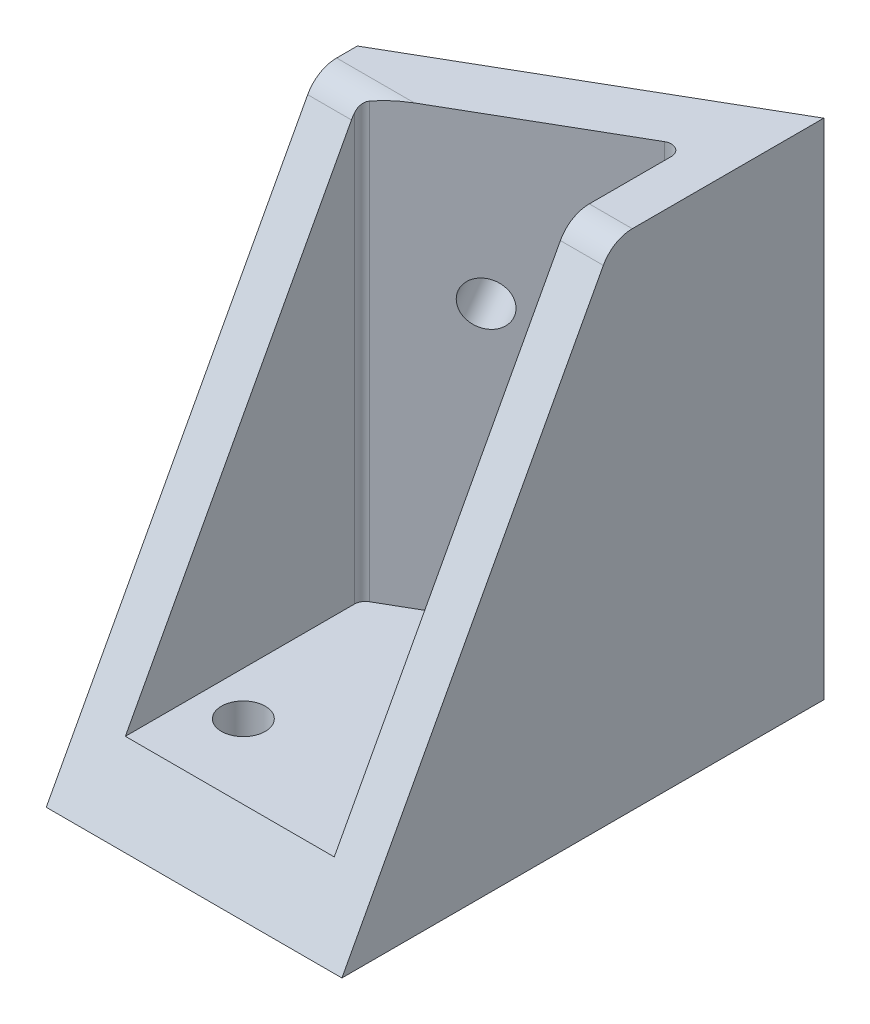
ISO-10303-21;
HEADER;
FILE_DESCRIPTION(('STEP AP214'),'2;1');
FILE_NAME('part.step','',(''),(''),'','','');
FILE_SCHEMA(('AUTOMOTIVE_DESIGN { 1 0 10303 214 1 1 1 1 }'));
ENDSEC;
DATA;
#1=APPLICATION_CONTEXT('core data for automotive mechanical design processes');
#2=APPLICATION_PROTOCOL_DEFINITION('international standard','automotive_design',2000,#1);
#3=PRODUCT_CONTEXT('',#1,'mechanical');
#4=PRODUCT('Part','Part','',(#3));
#5=PRODUCT_RELATED_PRODUCT_CATEGORY('part','',(#4));
#6=PRODUCT_DEFINITION_FORMATION('','',#4);
#7=PRODUCT_DEFINITION_CONTEXT('part definition',#1,'design');
#8=PRODUCT_DEFINITION('design','',#6,#7);
#9=PRODUCT_DEFINITION_SHAPE('','',#8);
#10=(LENGTH_UNIT() NAMED_UNIT(*) SI_UNIT(.MILLI.,.METRE.));
#11=(NAMED_UNIT(*) PLANE_ANGLE_UNIT() SI_UNIT($,.RADIAN.));
#12=(NAMED_UNIT(*) SI_UNIT($,.STERADIAN.) SOLID_ANGLE_UNIT());
#13=UNCERTAINTY_MEASURE_WITH_UNIT(LENGTH_MEASURE(1.E-05),#10,'distance_accuracy_value','');
#14=(GEOMETRIC_REPRESENTATION_CONTEXT(3) GLOBAL_UNCERTAINTY_ASSIGNED_CONTEXT((#13)) GLOBAL_UNIT_ASSIGNED_CONTEXT((#10,
#11,#12)) REPRESENTATION_CONTEXT('',''));
#15=CARTESIAN_POINT('',(0.,0.,0.));
#16=DIRECTION('',(0.,0.,1.));
#17=DIRECTION('',(1.,0.,0.));
#18=AXIS2_PLACEMENT_3D('',#15,#16,#17);
#19=CARTESIAN_POINT('',(0.,6.,0.));
#20=DIRECTION('',(0.,-1.,0.));
#21=DIRECTION('',(0.,0.,-1.));
#22=AXIS2_PLACEMENT_3D('',#19,#20,#21);
#23=PLANE('',#22);
#24=CARTESIAN_POINT('',(-5.5,6.,12.));
#25=DIRECTION('',(0.,1.,0.));
#26=DIRECTION('',(0.,0.,1.));
#27=AXIS2_PLACEMENT_3D('',#24,#25,#26);
#28=CIRCLE('',#27,2.);
#29=CARTESIAN_POINT('',(-5.5,6.,14.));
#30=VERTEX_POINT('',#29);
#31=EDGE_CURVE('E439',#30,#30,#28,.T.);
#32=ORIENTED_EDGE('',*,*,#31,.F.);
#33=EDGE_LOOP('',(#32));
#34=FACE_BOUND('',#33,.T.);
#35=CARTESIAN_POINT('',(4.5,6.,2.));
#36=DIRECTION('',(0.,1.,0.));
#37=DIRECTION('',(0.,0.,1.));
#38=AXIS2_PLACEMENT_3D('',#35,#36,#37);
#39=CIRCLE('',#38,2.);
#40=CARTESIAN_POINT('',(4.5,6.,4.));
#41=VERTEX_POINT('',#40);
#42=EDGE_CURVE('E438',#41,#41,#39,.T.);
#43=ORIENTED_EDGE('',*,*,#42,.F.);
#44=EDGE_LOOP('',(#43));
#45=FACE_BOUND('',#44,.T.);
#46=DIRECTION('',(0.,0.,1.));
#47=VECTOR('',#46,1.);
#48=CARTESIAN_POINT('',(9.57596477822508,6.,-13.7344572083989));
#49=LINE('',#48,#47);
#50=CARTESIAN_POINT('',(9.57596477822508,6.,-12.0024064008298));
#51=VERTEX_POINT('',#50);
#52=CARTESIAN_POINT('',(9.57596477822509,6.00000000000001,18.7754509480156));
#53=VERTEX_POINT('',#52);
#54=EDGE_CURVE('E464',#51,#53,#49,.T.);
#55=ORIENTED_EDGE('',*,*,#54,.F.);
#56=CARTESIAN_POINT('',(8.57596477822508,6.00000000000001,-12.0024064008298));
#57=DIRECTION('',(0.,-1.,0.));
#58=DIRECTION('',(0.,0.,-1.));
#59=AXIS2_PLACEMENT_3D('',#56,#57,#58);
#60=CIRCLE('',#59,1.);
#61=CARTESIAN_POINT('',(8.07596477822508,6.,-12.8684318046143));
#62=VERTEX_POINT('',#61);
#63=EDGE_CURVE('E174',#51,#62,#60,.F.);
#64=ORIENTED_EDGE('',*,*,#63,.T.);
#65=DIRECTION('',(0.866025403784441,0.,-0.499999999999995));
#66=VECTOR('',#65,1.);
#67=CARTESIAN_POINT('',(-13.5,6.,-0.411542731880314));
#68=LINE('',#67,#66);
#69=CARTESIAN_POINT('',(-8.99999999999999,6.,-3.0096189432336));
#70=VERTEX_POINT('',#69);
#71=EDGE_CURVE('E472',#70,#62,#68,.T.);
#72=ORIENTED_EDGE('',*,*,#71,.F.);
#73=CARTESIAN_POINT('',(-8.5,6.,-2.14359353944916));
#74=DIRECTION('',(0.,-1.,0.));
#75=DIRECTION('',(0.,0.,-1.));
#76=AXIS2_PLACEMENT_3D('',#73,#74,#75);
#77=CIRCLE('',#76,1.);
#78=CARTESIAN_POINT('',(-9.5,6.,-2.14359353944916));
#79=VERTEX_POINT('',#78);
#80=EDGE_CURVE('E172',#70,#79,#77,.F.);
#81=ORIENTED_EDGE('',*,*,#80,.T.);
#82=DIRECTION('',(0.,0.,-1.));
#83=VECTOR('',#82,1.);
#84=CARTESIAN_POINT('',(-9.5,6.,22.));
#85=LINE('',#84,#83);
#86=CARTESIAN_POINT('',(-9.5,6.,18.7754509480156));
#87=VERTEX_POINT('',#86);
#88=EDGE_CURVE('E469',#87,#79,#85,.T.);
#89=ORIENTED_EDGE('',*,*,#88,.F.);
#90=DIRECTION('',(1.,0.,0.));
#91=VECTOR('',#90,1.);
#92=CARTESIAN_POINT('',(0.,6.,18.7754509480156));
#93=LINE('',#92,#91);
#94=EDGE_CURVE('E142',#87,#53,#93,.T.);
#95=ORIENTED_EDGE('',*,*,#94,.T.);
#96=EDGE_LOOP('',(#55,#64,#72,#81,#89,#95));
#97=FACE_BOUND('',#96,.T.);
#98=ADVANCED_FACE('F40',(#34,#45,#97),#23,.F.);
#99=CARTESIAN_POINT('',(-13.5,46.,-0.411542731880314));
#100=DIRECTION('',(-0.499999999999995,0.,-0.866025403784442));
#101=DIRECTION('',(-0.866025403784442,0.,0.499999999999995));
#102=AXIS2_PLACEMENT_3D('',#99,#100,#101);
#103=PLANE('',#102);
#104=CARTESIAN_POINT('',(2.08845726811992,18.5,-9.41154273188021));
#105=DIRECTION('',(-0.499999999999995,0.,-0.866025403784442));
#106=DIRECTION('',(-0.866025403784442,0.,0.499999999999995));
#107=AXIS2_PLACEMENT_3D('',#104,#105,#106);
#108=CIRCLE('',#107,2.);
#109=CARTESIAN_POINT('',(0.356406460551041,18.5,-8.41154273188022));
#110=VERTEX_POINT('',#109);
#111=EDGE_CURVE('E461',#110,#110,#108,.T.);
#112=ORIENTED_EDGE('',*,*,#111,.T.);
#113=EDGE_LOOP('',(#112));
#114=FACE_BOUND('',#113,.T.);
#115=CARTESIAN_POINT('',(-2.24166975080228,31.,-6.91154273188023));
#116=DIRECTION('',(-0.499999999999995,0.,-0.866025403784442));
#117=DIRECTION('',(-0.866025403784442,0.,0.499999999999995));
#118=AXIS2_PLACEMENT_3D('',#115,#116,#117);
#119=CIRCLE('',#118,2.);
#120=CARTESIAN_POINT('',(-3.97372055837117,31.,-5.91154273188024));
#121=VERTEX_POINT('',#120);
#122=EDGE_CURVE('E456',#121,#121,#119,.T.);
#123=ORIENTED_EDGE('',*,*,#122,.T.);
#124=EDGE_LOOP('',(#123));
#125=FACE_BOUND('',#124,.T.);
#126=DIRECTION('',(0.866025403784441,0.,-0.499999999999995));
#127=VECTOR('',#126,1.);
#128=CARTESIAN_POINT('',(-13.5,46.,-0.411542731880314));
#129=LINE('',#128,#127);
#130=CARTESIAN_POINT('',(-6.39249670249603,46.,-4.51506167396033));
#131=VERTEX_POINT('',#130);
#132=CARTESIAN_POINT('',(8.07596477822508,46.,-12.8684318046143));
#133=VERTEX_POINT('',#132);
#134=EDGE_CURVE('E479',#131,#133,#129,.T.);
#135=ORIENTED_EDGE('',*,*,#134,.F.);
#136=CARTESIAN_POINT('',(-6.39249670249602,43.,-4.51506167396033));
#137=DIRECTION('',(-0.499999999999995,0.,-0.866025403784442));
#138=DIRECTION('',(0.866025403784442,0.,-0.499999999999995));
#139=AXIS2_PLACEMENT_3D('',#136,#137,#138);
#140=ELLIPSE('',#139,6.00000000000006,3.);
#141=CARTESIAN_POINT('',(-8.99999999999999,45.5949262387401,-3.0096189432336));
#142=VERTEX_POINT('',#141);
#143=EDGE_CURVE('E63',#131,#142,#140,.F.);
#144=ORIENTED_EDGE('',*,*,#143,.T.);
#145=DIRECTION('',(0.,-1.,0.));
#146=VECTOR('',#145,1.);
#147=CARTESIAN_POINT('',(-8.99999999999999,6.,-3.0096189432336));
#148=LINE('',#147,#146);
#149=EDGE_CURVE('E176',#142,#70,#148,.T.);
#150=ORIENTED_EDGE('',*,*,#149,.T.);
#151=ORIENTED_EDGE('',*,*,#71,.T.);
#152=DIRECTION('',(0.,-1.,0.));
#153=VECTOR('',#152,1.);
#154=CARTESIAN_POINT('',(8.07596477822509,46.,-12.8684318046143));
#155=LINE('',#154,#153);
#156=EDGE_CURVE('E178',#62,#133,#155,.F.);
#157=ORIENTED_EDGE('',*,*,#156,.T.);
#158=EDGE_LOOP('',(#135,#144,#150,#151,#157));
#159=FACE_BOUND('',#158,.T.);
#160=ADVANCED_FACE('F222',(#114,#125,#159),#103,.F.);
#161=CARTESIAN_POINT('',(13.5,6.,22.));
#162=DIRECTION('',(-1.,0.,0.));
#163=DIRECTION('',(0.,0.,1.));
#164=AXIS2_PLACEMENT_3D('',#161,#162,#163);
#165=PLANE('',#164);
#166=DIRECTION('',(0.,0.,-1.));
#167=VECTOR('',#166,1.);
#168=CARTESIAN_POINT('',(13.5,46.,-16.));
#169=LINE('',#168,#167);
#170=CARTESIAN_POINT('',(13.5,46.,-4.51506167396033));
#171=VERTEX_POINT('',#170);
#172=CARTESIAN_POINT('',(13.5,46.,-22.));
#173=VERTEX_POINT('',#172);
#174=EDGE_CURVE('E481',#171,#173,#169,.T.);
#175=ORIENTED_EDGE('',*,*,#174,.F.);
#176=CARTESIAN_POINT('',(13.5,43.,-4.51506167396033));
#177=DIRECTION('',(-1.,0.,0.));
#178=DIRECTION('',(0.,0.,1.));
#179=AXIS2_PLACEMENT_3D('',#176,#177,#178);
#180=CIRCLE('',#179,3.);
#181=CARTESIAN_POINT('',(13.5,44.4201752464792,-1.8725056633358));
#182=VERTEX_POINT('',#181);
#183=EDGE_CURVE('E138',#171,#182,#180,.F.);
#184=ORIENTED_EDGE('',*,*,#183,.T.);
#185=DIRECTION('',(0.,-0.880852003541511,0.473391748826388));
#186=VECTOR('',#185,1.);
#187=CARTESIAN_POINT('',(13.5,0.,22.));
#188=LINE('',#187,#186);
#189=CARTESIAN_POINT('',(13.5,0.,22.));
#190=VERTEX_POINT('',#189);
#191=EDGE_CURVE('E130',#182,#190,#188,.T.);
#192=ORIENTED_EDGE('',*,*,#191,.T.);
#193=DIRECTION('',(0.,0.,-1.));
#194=VECTOR('',#193,1.);
#195=CARTESIAN_POINT('',(13.5,0.,22.));
#196=LINE('',#195,#194);
#197=CARTESIAN_POINT('',(13.5,0.,-22.));
#198=VERTEX_POINT('',#197);
#199=EDGE_CURVE('E136',#190,#198,#196,.T.);
#200=ORIENTED_EDGE('',*,*,#199,.T.);
#201=DIRECTION('',(0.,-1.,0.));
#202=VECTOR('',#201,1.);
#203=CARTESIAN_POINT('',(13.5,6.,-22.));
#204=LINE('',#203,#202);
#205=EDGE_CURVE('E153',#173,#198,#204,.T.);
#206=ORIENTED_EDGE('',*,*,#205,.F.);
#207=EDGE_LOOP('',(#175,#184,#192,#200,#206));
#208=FACE_BOUND('',#207,.T.);
#209=ADVANCED_FACE('F133',(#208),#165,.F.);
#210=CARTESIAN_POINT('',(-13.5,6.,22.));
#211=DIRECTION('',(1.,0.,0.));
#212=DIRECTION('',(0.,0.,-1.));
#213=AXIS2_PLACEMENT_3D('',#210,#211,#212);
#214=PLANE('',#213);
#215=DIRECTION('',(0.,-0.880852003541511,0.473391748826388));
#216=VECTOR('',#215,1.);
#217=CARTESIAN_POINT('',(-13.5,0.,22.));
#218=LINE('',#217,#216);
#219=CARTESIAN_POINT('',(-13.5,44.4201752464792,-1.8725056633358));
#220=VERTEX_POINT('',#219);
#221=CARTESIAN_POINT('',(-13.5,0.,22.));
#222=VERTEX_POINT('',#221);
#223=EDGE_CURVE('E143',#220,#222,#218,.T.);
#224=ORIENTED_EDGE('',*,*,#223,.F.);
#225=CARTESIAN_POINT('',(-13.5,43.,-4.51506167396033));
#226=DIRECTION('',(1.,0.,0.));
#227=DIRECTION('',(0.,0.,-1.));
#228=AXIS2_PLACEMENT_3D('',#225,#226,#227);
#229=CIRCLE('',#228,3.);
#230=CARTESIAN_POINT('',(-13.5,46.,-4.51506167396033));
#231=VERTEX_POINT('',#230);
#232=EDGE_CURVE('E196',#220,#231,#229,.F.);
#233=ORIENTED_EDGE('',*,*,#232,.T.);
#234=DIRECTION('',(0.,0.,1.));
#235=VECTOR('',#234,1.);
#236=CARTESIAN_POINT('',(-13.5,46.,-6.41154273188031));
#237=LINE('',#236,#235);
#238=CARTESIAN_POINT('',(-13.5,46.,-6.41154273188031));
#239=VERTEX_POINT('',#238);
#240=EDGE_CURVE('E476',#239,#231,#237,.T.);
#241=ORIENTED_EDGE('',*,*,#240,.F.);
#242=DIRECTION('',(0.,1.,0.));
#243=VECTOR('',#242,1.);
#244=CARTESIAN_POINT('',(-13.5,0.,-6.41154273188031));
#245=LINE('',#244,#243);
#246=CARTESIAN_POINT('',(-13.5,0.,-6.41154273188031));
#247=VERTEX_POINT('',#246);
#248=EDGE_CURVE('E159',#247,#239,#245,.T.);
#249=ORIENTED_EDGE('',*,*,#248,.F.);
#250=DIRECTION('',(0.,0.,1.));
#251=VECTOR('',#250,1.);
#252=CARTESIAN_POINT('',(-13.5,0.,22.));
#253=LINE('',#252,#251);
#254=EDGE_CURVE('E154',#247,#222,#253,.T.);
#255=ORIENTED_EDGE('',*,*,#254,.T.);
#256=EDGE_LOOP('',(#224,#233,#241,#249,#255));
#257=FACE_BOUND('',#256,.T.);
#258=ADVANCED_FACE('F237',(#257),#214,.F.);
#259=CARTESIAN_POINT('',(0.,0.,0.));
#260=DIRECTION('',(0.,-1.,0.));
#261=DIRECTION('',(0.,0.,-1.));
#262=AXIS2_PLACEMENT_3D('',#259,#260,#261);
#263=PLANE('',#262);
#264=CARTESIAN_POINT('',(-5.5,0.,12.));
#265=DIRECTION('',(0.,1.,0.));
#266=DIRECTION('',(0.,0.,1.));
#267=AXIS2_PLACEMENT_3D('',#264,#265,#266);
#268=CIRCLE('',#267,2.);
#269=CARTESIAN_POINT('',(-5.5,0.,14.));
#270=VERTEX_POINT('',#269);
#271=EDGE_CURVE('E442',#270,#270,#268,.T.);
#272=ORIENTED_EDGE('',*,*,#271,.T.);
#273=EDGE_LOOP('',(#272));
#274=FACE_BOUND('',#273,.T.);
#275=CARTESIAN_POINT('',(4.5,0.,2.));
#276=DIRECTION('',(0.,1.,0.));
#277=DIRECTION('',(0.,0.,1.));
#278=AXIS2_PLACEMENT_3D('',#275,#276,#277);
#279=CIRCLE('',#278,2.);
#280=CARTESIAN_POINT('',(4.5,0.,4.));
#281=VERTEX_POINT('',#280);
#282=EDGE_CURVE('E435',#281,#281,#279,.T.);
#283=ORIENTED_EDGE('',*,*,#282,.T.);
#284=EDGE_LOOP('',(#283));
#285=FACE_BOUND('',#284,.T.);
#286=DIRECTION('',(0.866025403784441,0.,-0.499999999999995));
#287=VECTOR('',#286,1.);
#288=CARTESIAN_POINT('',(13.5,0.,-22.));
#289=LINE('',#288,#287);
#290=EDGE_CURVE('E158',#247,#198,#289,.T.);
#291=ORIENTED_EDGE('',*,*,#290,.T.);
#292=ORIENTED_EDGE('',*,*,#199,.F.);
#293=DIRECTION('',(1.,0.,0.));
#294=VECTOR('',#293,1.);
#295=CARTESIAN_POINT('',(-13.5,0.,22.));
#296=LINE('',#295,#294);
#297=EDGE_CURVE('E146',#222,#190,#296,.T.);
#298=ORIENTED_EDGE('',*,*,#297,.F.);
#299=ORIENTED_EDGE('',*,*,#254,.F.);
#300=EDGE_LOOP('',(#291,#292,#298,#299));
#301=FACE_BOUND('',#300,.T.);
#302=ADVANCED_FACE('F157',(#274,#285,#301),#263,.T.);
#303=CARTESIAN_POINT('',(13.5,0.,-22.));
#304=DIRECTION('',(0.499999999999995,0.,0.866025403784442));
#305=DIRECTION('',(0.866025403784442,0.,-0.499999999999995));
#306=AXIS2_PLACEMENT_3D('',#303,#304,#305);
#307=PLANE('',#306);
#308=CARTESIAN_POINT('',(-0.509618943233377,18.5,-13.9115427318802));
#309=DIRECTION('',(-0.499999999999995,0.,-0.866025403784442));
#310=DIRECTION('',(-0.866025403784442,0.,0.499999999999995));
#311=AXIS2_PLACEMENT_3D('',#308,#309,#310);
#312=CIRCLE('',#311,2.);
#313=CARTESIAN_POINT('',(-2.24166975080226,18.5,-12.9115427318803));
#314=VERTEX_POINT('',#313);
#315=EDGE_CURVE('E453',#314,#314,#312,.T.);
#316=ORIENTED_EDGE('',*,*,#315,.F.);
#317=EDGE_LOOP('',(#316));
#318=FACE_BOUND('',#317,.T.);
#319=CARTESIAN_POINT('',(-4.83974596215558,31.,-11.4115427318803));
#320=DIRECTION('',(-0.499999999999995,0.,-0.866025403784442));
#321=DIRECTION('',(-0.866025403784442,0.,0.499999999999995));
#322=AXIS2_PLACEMENT_3D('',#319,#320,#321);
#323=CIRCLE('',#322,2.);
#324=CARTESIAN_POINT('',(-6.57179676972447,31.,-10.4115427318803));
#325=VERTEX_POINT('',#324);
#326=EDGE_CURVE('E452',#325,#325,#323,.T.);
#327=ORIENTED_EDGE('',*,*,#326,.F.);
#328=EDGE_LOOP('',(#327));
#329=FACE_BOUND('',#328,.T.);
#330=ORIENTED_EDGE('',*,*,#248,.T.);
#331=DIRECTION('',(-0.866025403784441,0.,0.499999999999995));
#332=VECTOR('',#331,1.);
#333=CARTESIAN_POINT('',(13.5,46.,-22.));
#334=LINE('',#333,#332);
#335=EDGE_CURVE('E473',#173,#239,#334,.T.);
#336=ORIENTED_EDGE('',*,*,#335,.F.);
#337=ORIENTED_EDGE('',*,*,#205,.T.);
#338=ORIENTED_EDGE('',*,*,#290,.F.);
#339=EDGE_LOOP('',(#330,#336,#337,#338));
#340=FACE_BOUND('',#339,.T.);
#341=ADVANCED_FACE('F234',(#318,#329,#340),#307,.F.);
#342=CARTESIAN_POINT('',(0.,46.,0.));
#343=DIRECTION('',(0.,1.,0.));
#344=DIRECTION('',(0.,0.,1.));
#345=AXIS2_PLACEMENT_3D('',#342,#343,#344);
#346=PLANE('',#345);
#347=DIRECTION('',(0.,0.,1.));
#348=VECTOR('',#347,1.);
#349=CARTESIAN_POINT('',(9.57596477822508,46.,-13.7344572083989));
#350=LINE('',#349,#348);
#351=CARTESIAN_POINT('',(9.57596477822508,46.,-12.0024064008298));
#352=VERTEX_POINT('',#351);
#353=CARTESIAN_POINT('',(9.57596477822508,46.,-4.51506167396033));
#354=VERTEX_POINT('',#353);
#355=EDGE_CURVE('E466',#352,#354,#350,.T.);
#356=ORIENTED_EDGE('',*,*,#355,.T.);
#357=DIRECTION('',(-1.,0.,0.));
#358=VECTOR('',#357,1.);
#359=CARTESIAN_POINT('',(13.5,46.,-4.51506167396033));
#360=LINE('',#359,#358);
#361=EDGE_CURVE('E193',#354,#171,#360,.F.);
#362=ORIENTED_EDGE('',*,*,#361,.T.);
#363=ORIENTED_EDGE('',*,*,#174,.T.);
#364=ORIENTED_EDGE('',*,*,#335,.T.);
#365=ORIENTED_EDGE('',*,*,#240,.T.);
#366=DIRECTION('',(-1.,0.,0.));
#367=VECTOR('',#366,1.);
#368=CARTESIAN_POINT('',(-9.31607274857588,46.,-4.51506167396033));
#369=LINE('',#368,#367);
#370=EDGE_CURVE('E191',#231,#131,#369,.F.);
#371=ORIENTED_EDGE('',*,*,#370,.T.);
#372=ORIENTED_EDGE('',*,*,#134,.T.);
#373=CARTESIAN_POINT('',(8.57596477822508,46.,-12.0024064008298));
#374=DIRECTION('',(0.,1.,0.));
#375=DIRECTION('',(0.,0.,1.));
#376=AXIS2_PLACEMENT_3D('',#373,#374,#375);
#377=CIRCLE('',#376,1.);
#378=EDGE_CURVE('E183',#133,#352,#377,.F.);
#379=ORIENTED_EDGE('',*,*,#378,.T.);
#380=EDGE_LOOP('',(#356,#362,#363,#364,#365,#371,#372,#379));
#381=FACE_BOUND('',#380,.T.);
#382=ADVANCED_FACE('F262',(#381),#346,.T.);
#383=CARTESIAN_POINT('',(-9.5,71.0424651899504,22.));
#384=DIRECTION('',(-1.,0.,0.));
#385=DIRECTION('',(0.,0.,1.));
#386=AXIS2_PLACEMENT_3D('',#383,#384,#385);
#387=PLANE('',#386);
#388=DIRECTION('',(0.,-1.,0.));
#389=VECTOR('',#388,1.);
#390=CARTESIAN_POINT('',(-9.5,45.9988855683722,-2.14359353944916));
#391=LINE('',#390,#389);
#392=CARTESIAN_POINT('',(-9.5,44.8374272467225,-2.14359353944916));
#393=VERTEX_POINT('',#392);
#394=EDGE_CURVE('E181',#79,#393,#391,.F.);
#395=ORIENTED_EDGE('',*,*,#394,.T.);
#396=CARTESIAN_POINT('',(-9.5,43.,-4.51506167396033));
#397=DIRECTION('',(-1.,0.,0.));
#398=DIRECTION('',(0.,0.,1.));
#399=AXIS2_PLACEMENT_3D('',#396,#397,#398);
#400=CIRCLE('',#399,3.);
#401=CARTESIAN_POINT('',(-9.5,44.4201752464792,-1.87250566333581));
#402=VERTEX_POINT('',#401);
#403=EDGE_CURVE('E11',#393,#402,#400,.F.);
#404=ORIENTED_EDGE('',*,*,#403,.T.);
#405=DIRECTION('',(0.,-0.880852003541511,0.473391748826388));
#406=VECTOR('',#405,1.);
#407=CARTESIAN_POINT('',(-9.5,55.1218666537495,-7.62386047699298));
#408=LINE('',#407,#406);
#409=EDGE_CURVE('E450',#402,#87,#408,.T.);
#410=ORIENTED_EDGE('',*,*,#409,.T.);
#411=ORIENTED_EDGE('',*,*,#88,.T.);
#412=EDGE_LOOP('',(#395,#404,#410,#411));
#413=FACE_BOUND('',#412,.T.);
#414=ADVANCED_FACE('F269',(#413),#387,.F.);
#415=CARTESIAN_POINT('',(9.57596477822508,84.2020686929613,-13.7344572083989));
#416=DIRECTION('',(1.,0.,0.));
#417=DIRECTION('',(0.,0.,-1.));
#418=AXIS2_PLACEMENT_3D('',#415,#416,#417);
#419=PLANE('',#418);
#420=DIRECTION('',(0.,0.880852003541511,-0.473391748826388));
#421=VECTOR('',#420,1.);
#422=CARTESIAN_POINT('',(9.57596477822508,80.2332486884515,-21.119340999329));
#423=LINE('',#422,#421);
#424=CARTESIAN_POINT('',(9.57596477822508,44.4201752464792,-1.8725056633358));
#425=VERTEX_POINT('',#424);
#426=EDGE_CURVE('E166',#53,#425,#423,.T.);
#427=ORIENTED_EDGE('',*,*,#426,.T.);
#428=CARTESIAN_POINT('',(9.57596477822508,43.,-4.51506167396033));
#429=DIRECTION('',(1.,0.,0.));
#430=DIRECTION('',(0.,0.,-1.));
#431=AXIS2_PLACEMENT_3D('',#428,#429,#430);
#432=CIRCLE('',#431,3.);
#433=EDGE_CURVE('E189',#425,#354,#432,.F.);
#434=ORIENTED_EDGE('',*,*,#433,.T.);
#435=ORIENTED_EDGE('',*,*,#355,.F.);
#436=DIRECTION('',(0.,-1.,0.));
#437=VECTOR('',#436,1.);
#438=CARTESIAN_POINT('',(9.57596477822508,6.00000000000001,-12.0024064008298));
#439=LINE('',#438,#437);
#440=EDGE_CURVE('E169',#352,#51,#439,.T.);
#441=ORIENTED_EDGE('',*,*,#440,.T.);
#442=ORIENTED_EDGE('',*,*,#54,.T.);
#443=EDGE_LOOP('',(#427,#434,#435,#441,#442));
#444=FACE_BOUND('',#443,.T.);
#445=ADVANCED_FACE('F277',(#444),#419,.F.);
#446=CARTESIAN_POINT('',(0.160254037844365,31.,-2.75128869403585));
#447=DIRECTION('',(-0.499999999999995,0.,-0.866025403784442));
#448=DIRECTION('',(-0.866025403784442,0.,0.499999999999995));
#449=AXIS2_PLACEMENT_3D('',#446,#447,#448);
#450=CYLINDRICAL_SURFACE('',#449,2.);
#451=ORIENTED_EDGE('',*,*,#326,.T.);
#452=EDGE_LOOP('',(#451));
#453=FACE_BOUND('',#452,.T.);
#454=ORIENTED_EDGE('',*,*,#122,.F.);
#455=EDGE_LOOP('',(#454));
#456=FACE_BOUND('',#455,.T.);
#457=ADVANCED_FACE('F285',(#453,#456),#450,.F.);
#458=CARTESIAN_POINT('',(4.49038105676657,18.5,-5.25128869403582));
#459=DIRECTION('',(-0.499999999999995,0.,-0.866025403784442));
#460=DIRECTION('',(-0.866025403784442,0.,0.499999999999995));
#461=AXIS2_PLACEMENT_3D('',#458,#459,#460);
#462=CYLINDRICAL_SURFACE('',#461,2.);
#463=ORIENTED_EDGE('',*,*,#315,.T.);
#464=EDGE_LOOP('',(#463));
#465=FACE_BOUND('',#464,.T.);
#466=ORIENTED_EDGE('',*,*,#111,.F.);
#467=EDGE_LOOP('',(#466));
#468=FACE_BOUND('',#467,.T.);
#469=ADVANCED_FACE('F293',(#465,#468),#462,.F.);
#470=CARTESIAN_POINT('',(13.5,0.,22.));
#471=DIRECTION('',(0.,-0.473391748826388,-0.880852003541511));
#472=DIRECTION('',(0.,0.880852003541511,-0.473391748826388));
#473=AXIS2_PLACEMENT_3D('',#470,#471,#472);
#474=PLANE('',#473);
#475=ORIENTED_EDGE('',*,*,#191,.F.);
#476=DIRECTION('',(-1.,0.,0.));
#477=VECTOR('',#476,1.);
#478=CARTESIAN_POINT('',(9.57596477822508,44.4201752464792,-1.8725056633358));
#479=LINE('',#478,#477);
#480=EDGE_CURVE('E187',#182,#425,#479,.T.);
#481=ORIENTED_EDGE('',*,*,#480,.T.);
#482=ORIENTED_EDGE('',*,*,#426,.F.);
#483=ORIENTED_EDGE('',*,*,#94,.F.);
#484=ORIENTED_EDGE('',*,*,#409,.F.);
#485=DIRECTION('',(-1.,0.,0.));
#486=VECTOR('',#485,1.);
#487=CARTESIAN_POINT('',(-13.5,44.4201752464792,-1.8725056633358));
#488=LINE('',#487,#486);
#489=EDGE_CURVE('E185',#402,#220,#488,.T.);
#490=ORIENTED_EDGE('',*,*,#489,.T.);
#491=ORIENTED_EDGE('',*,*,#223,.T.);
#492=ORIENTED_EDGE('',*,*,#297,.T.);
#493=EDGE_LOOP('',(#475,#481,#482,#483,#484,#490,#491,#492));
#494=FACE_BOUND('',#493,.T.);
#495=ADVANCED_FACE('F147',(#494),#474,.F.);
#496=CARTESIAN_POINT('',(8.57596477822508,84.2020686929613,-12.0024064008298));
#497=DIRECTION('',(0.,1.,0.));
#498=DIRECTION('',(0.,0.,1.));
#499=AXIS2_PLACEMENT_3D('',#496,#497,#498);
#500=CYLINDRICAL_SURFACE('',#499,1.);
#501=ORIENTED_EDGE('',*,*,#378,.F.);
#502=ORIENTED_EDGE('',*,*,#156,.F.);
#503=ORIENTED_EDGE('',*,*,#63,.F.);
#504=ORIENTED_EDGE('',*,*,#440,.F.);
#505=EDGE_LOOP('',(#501,#502,#503,#504));
#506=FACE_BOUND('',#505,.T.);
#507=ADVANCED_FACE('F208',(#506),#500,.F.);
#508=CARTESIAN_POINT('',(-8.5,46.,-2.14359353944916));
#509=DIRECTION('',(0.,1.,0.));
#510=DIRECTION('',(0.,0.,1.));
#511=AXIS2_PLACEMENT_3D('',#508,#509,#510);
#512=CYLINDRICAL_SURFACE('',#511,1.);
#513=ORIENTED_EDGE('',*,*,#149,.F.);
#514=CARTESIAN_POINT('',(-8.99999999999999,45.5949262387401,-3.0096189432336));
#515=CARTESIAN_POINT('',(-9.02370237410427,45.5869882689934,-2.99593728737091));
#516=CARTESIAN_POINT('',(-9.0466600913381,45.5783995645777,-2.98138168952848));
#517=CARTESIAN_POINT('',(-9.09095702374349,45.559928816247,-2.95074529734695));
#518=CARTESIAN_POINT('',(-9.11229735297097,45.550047675587,-2.93466557032884));
#519=CARTESIAN_POINT('',(-9.17342047022176,45.5186275786484,-2.88470984218));
#520=CARTESIAN_POINT('',(-9.21068602277742,45.495185371964,-2.84889260667361));
#521=CARTESIAN_POINT('',(-9.27778673965688,45.4436044405593,-2.7741271021164));
#522=CARTESIAN_POINT('',(-9.30763842012502,45.4154763927071,-2.7351860530636));
#523=CARTESIAN_POINT('',(-9.36019618699083,45.3549044371093,-2.65577986938822));
#524=CARTESIAN_POINT('',(-9.38288907597792,45.3224527133419,-2.61531207209941));
#525=CARTESIAN_POINT('',(-9.42973292743756,45.2393412747826,-2.51730954347963));
#526=CARTESIAN_POINT('',(-9.45046976324452,45.1867708035972,-2.45976783961499));
#527=CARTESIAN_POINT('',(-9.4806994189321,45.0756600207375,-2.34759769515946));
#528=CARTESIAN_POINT('',(-9.49017609392651,45.017111267574,-2.29297354461176));
#529=CARTESIAN_POINT('',(-9.49690434839167,44.936909216844,-2.22398254105001));
#530=CARTESIAN_POINT('',(-9.49808652308494,44.9172690287562,-2.20752209308152));
#531=CARTESIAN_POINT('',(-9.4996325597741,44.8776288440621,-2.17515570258462));
#532=CARTESIAN_POINT('',(-9.49999950271128,44.857630491055,-2.15924789676972));
#533=CARTESIAN_POINT('',(-9.5,44.8374272467225,-2.14359353944915));
#534=B_SPLINE_CURVE_WITH_KNOTS('',3,(#514,#515,#516,#517,#518,#519,#520,#521,#522,#523,#524,
#525,#526,#527,#528,#529,#530,#531,#532,#533),.UNSPECIFIED.,.F.,.F.,(4,2,2,2,2,2,2,2,2,4),(0.,
0.0854228733502598,0.17078636239845,0.340153732489077,0.509140342503192,0.678436687232054,
0.919063029995087,1.16003396952026,1.23698085624398,1.31363644539732),.UNSPECIFIED.);
#535=EDGE_CURVE('E49',#142,#393,#534,.T.);
#536=ORIENTED_EDGE('',*,*,#535,.T.);
#537=ORIENTED_EDGE('',*,*,#394,.F.);
#538=ORIENTED_EDGE('',*,*,#80,.F.);
#539=EDGE_LOOP('',(#513,#536,#537,#538));
#540=FACE_BOUND('',#539,.T.);
#541=ADVANCED_FACE('F203',(#540),#512,.F.);
#542=CARTESIAN_POINT('',(4.5,0.,2.));
#543=DIRECTION('',(0.,1.,0.));
#544=DIRECTION('',(0.,0.,1.));
#545=AXIS2_PLACEMENT_3D('',#542,#543,#544);
#546=CYLINDRICAL_SURFACE('',#545,2.);
#547=ORIENTED_EDGE('',*,*,#282,.F.);
#548=EDGE_LOOP('',(#547));
#549=FACE_BOUND('',#548,.T.);
#550=ORIENTED_EDGE('',*,*,#42,.T.);
#551=EDGE_LOOP('',(#550));
#552=FACE_BOUND('',#551,.T.);
#553=ADVANCED_FACE('F207',(#549,#552),#546,.F.);
#554=CARTESIAN_POINT('',(-5.5,0.,12.));
#555=DIRECTION('',(0.,1.,0.));
#556=DIRECTION('',(0.,0.,1.));
#557=AXIS2_PLACEMENT_3D('',#554,#555,#556);
#558=CYLINDRICAL_SURFACE('',#557,2.);
#559=ORIENTED_EDGE('',*,*,#271,.F.);
#560=EDGE_LOOP('',(#559));
#561=FACE_BOUND('',#560,.T.);
#562=ORIENTED_EDGE('',*,*,#31,.T.);
#563=EDGE_LOOP('',(#562));
#564=FACE_BOUND('',#563,.T.);
#565=ADVANCED_FACE('F212',(#561,#564),#558,.F.);
#566=CARTESIAN_POINT('',(13.5,43.,-4.51506167396033));
#567=DIRECTION('',(1.,0.,0.));
#568=DIRECTION('',(0.,0.,-1.));
#569=AXIS2_PLACEMENT_3D('',#566,#567,#568);
#570=CYLINDRICAL_SURFACE('',#569,3.);
#571=ORIENTED_EDGE('',*,*,#183,.F.);
#572=ORIENTED_EDGE('',*,*,#361,.F.);
#573=ORIENTED_EDGE('',*,*,#433,.F.);
#574=ORIENTED_EDGE('',*,*,#480,.F.);
#575=EDGE_LOOP('',(#571,#572,#573,#574));
#576=FACE_BOUND('',#575,.T.);
#577=ADVANCED_FACE('F210',(#576),#570,.T.);
#578=CARTESIAN_POINT('',(13.5,43.,-4.51506167396033));
#579=DIRECTION('',(1.,0.,0.));
#580=DIRECTION('',(0.,0.,-1.));
#581=AXIS2_PLACEMENT_3D('',#578,#579,#580);
#582=CYLINDRICAL_SURFACE('',#581,3.);
#583=ORIENTED_EDGE('',*,*,#143,.F.);
#584=ORIENTED_EDGE('',*,*,#370,.F.);
#585=ORIENTED_EDGE('',*,*,#232,.F.);
#586=ORIENTED_EDGE('',*,*,#489,.F.);
#587=ORIENTED_EDGE('',*,*,#403,.F.);
#588=ORIENTED_EDGE('',*,*,#535,.F.);
#589=EDGE_LOOP('',(#583,#584,#585,#586,#587,#588));
#590=FACE_BOUND('',#589,.T.);
#591=ADVANCED_FACE('F42',(#590),#582,.T.);
#592=CLOSED_SHELL('',(#98,#160,#209,#258,#302,#341,#382,#414,#445,#457,#469,#495,#507,#541,#553,
#565,#577,#591));
#593=MANIFOLD_SOLID_BREP('B2',#592);
#594=ADVANCED_BREP_SHAPE_REPRESENTATION('',(#18,#593),#14);
#595=SHAPE_DEFINITION_REPRESENTATION(#9,#594);
ENDSEC;
END-ISO-10303-21;
